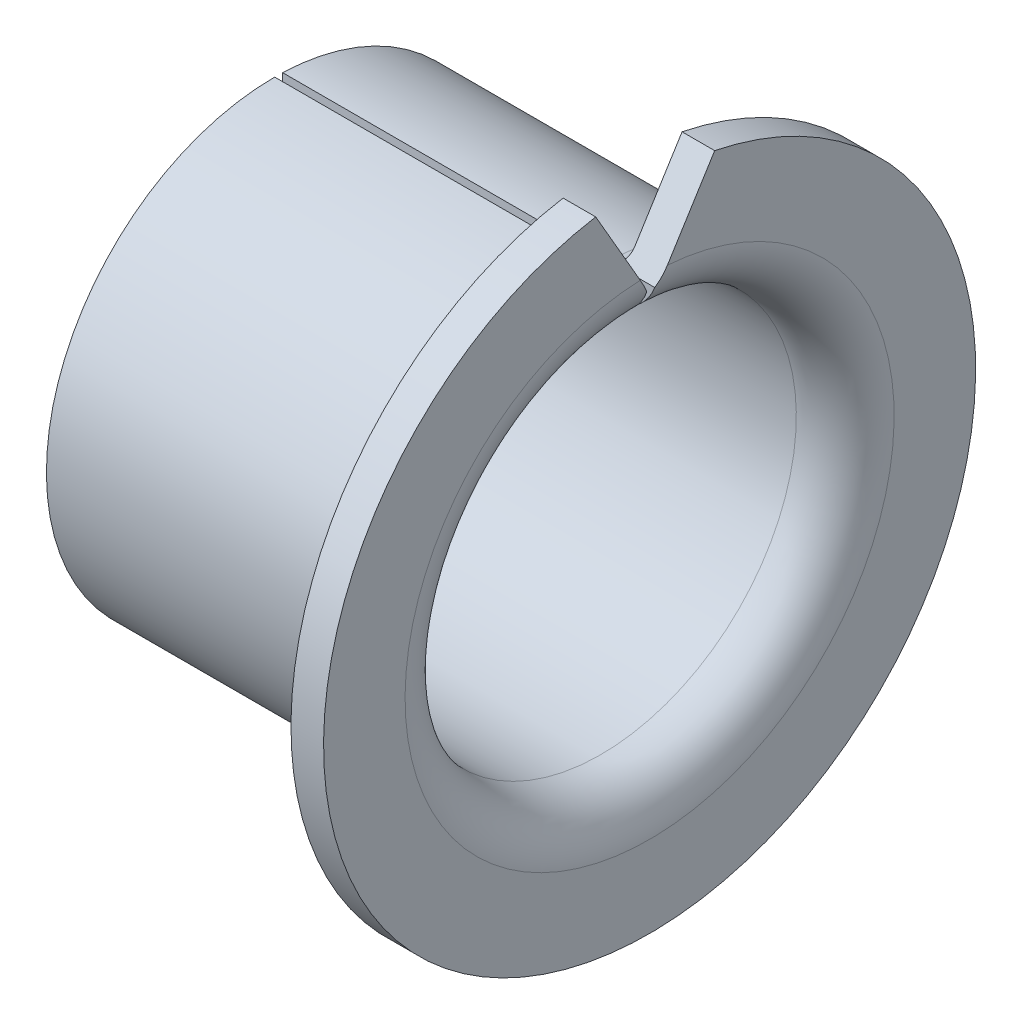
ISO-10303-21;
HEADER;
FILE_DESCRIPTION(('STEP AP214'),'2;1');
FILE_NAME('part.step','',(''),(''),'','','');
FILE_SCHEMA(('AUTOMOTIVE_DESIGN { 1 0 10303 214 1 1 1 1 }'));
ENDSEC;
DATA;
#1=APPLICATION_CONTEXT('core data for automotive mechanical design processes');
#2=APPLICATION_PROTOCOL_DEFINITION('international standard','automotive_design',2000,#1);
#3=PRODUCT_CONTEXT('',#1,'mechanical');
#4=PRODUCT('Part','Part','',(#3));
#5=PRODUCT_RELATED_PRODUCT_CATEGORY('part','',(#4));
#6=PRODUCT_DEFINITION_FORMATION('','',#4);
#7=PRODUCT_DEFINITION_CONTEXT('part definition',#1,'design');
#8=PRODUCT_DEFINITION('design','',#6,#7);
#9=PRODUCT_DEFINITION_SHAPE('','',#8);
#10=(LENGTH_UNIT() NAMED_UNIT(*) SI_UNIT(.MILLI.,.METRE.));
#11=(NAMED_UNIT(*) PLANE_ANGLE_UNIT() SI_UNIT($,.RADIAN.));
#12=(NAMED_UNIT(*) SI_UNIT($,.STERADIAN.) SOLID_ANGLE_UNIT());
#13=UNCERTAINTY_MEASURE_WITH_UNIT(LENGTH_MEASURE(1.E-05),#10,'distance_accuracy_value','');
#14=(GEOMETRIC_REPRESENTATION_CONTEXT(3) GLOBAL_UNCERTAINTY_ASSIGNED_CONTEXT((#13)) GLOBAL_UNIT_ASSIGNED_CONTEXT((#10,
#11,#12)) REPRESENTATION_CONTEXT('',''));
#15=CARTESIAN_POINT('',(0.,0.,0.));
#16=DIRECTION('',(0.,0.,1.));
#17=DIRECTION('',(1.,0.,0.));
#18=AXIS2_PLACEMENT_3D('',#15,#16,#17);
#19=CARTESIAN_POINT('',(10.,0.,0.));
#20=DIRECTION('',(-1.,0.,0.));
#21=DIRECTION('',(0.,0.,1.));
#22=AXIS2_PLACEMENT_3D('',#19,#20,#21);
#23=TOROIDAL_SURFACE('',#22,7.5,1.5);
#24=CARTESIAN_POINT('',(11.499988949231,7.5002,0.288790604648647));
#25=CARTESIAN_POINT('',(11.5001546386734,7.45775465983134,0.264284776076427));
#26=CARTESIAN_POINT('',(11.4984413437354,7.41531521186354,0.239782349367959));
#27=CARTESIAN_POINT('',(11.4913330317433,7.33090663893235,0.191049037064227));
#28=CARTESIAN_POINT('',(11.485958672951,7.28893621104406,0.166817399224915));
#29=CARTESIAN_POINT('',(11.4643997452174,7.16353320403578,0.0944159393715009));
#30=CARTESIAN_POINT('',(11.4427791658378,7.08077743629816,0.0466368745911877));
#31=CARTESIAN_POINT('',(11.4141428361213,6.99980000000054,-0.000115470053528239));
#32=B_SPLINE_CURVE_WITH_KNOTS('',3,(#24,#25,#26,#27,#28,#29,#30,#31),.UNSPECIFIED.,.F.,.F.,(4,2,
2,4),(0.,0.146975491171997,0.293128440273649,0.58601194646571),.UNSPECIFIED.);
#33=CARTESIAN_POINT('',(11.5,7.49456264653803,0.285535877109862));
#34=VERTEX_POINT('',#33);
#35=CARTESIAN_POINT('',(11.4142135623731,7.,0.));
#36=VERTEX_POINT('',#35);
#37=EDGE_CURVE('E47',#34,#36,#32,.T.);
#38=ORIENTED_EDGE('',*,*,#37,.F.);
#39=CARTESIAN_POINT('',(11.5,0.,0.));
#40=DIRECTION('',(-1.,0.,0.));
#41=DIRECTION('',(0.,0.,1.));
#42=AXIS2_PLACEMENT_3D('',#39,#40,#41);
#43=CIRCLE('',#42,7.5);
#44=CARTESIAN_POINT('',(11.5,7.48003210306843,-0.546918400737887));
#45=VERTEX_POINT('',#44);
#46=EDGE_CURVE('E120',#45,#34,#43,.T.);
#47=ORIENTED_EDGE('',*,*,#46,.F.);
#48=CARTESIAN_POINT('',(11.414141336497,6.99553578913414,-0.244171503047322));
#49=CARTESIAN_POINT('',(11.4436225034062,7.07717137729921,-0.295183080116763));
#50=CARTESIAN_POINT('',(11.4656674526405,7.16065124727563,-0.347347092366405));
#51=CARTESIAN_POINT('',(11.4872021827046,7.28714152839566,-0.426386992352702));
#52=CARTESIAN_POINT('',(11.4924588188797,7.32947172523746,-0.452837835019432));
#53=CARTESIAN_POINT('',(11.499108472332,7.41460324484908,-0.506033912506195));
#54=CARTESIAN_POINT('',(11.5004782376455,7.45740587156478,-0.532779962122051));
#55=CARTESIAN_POINT('',(11.499852412834,7.5002,-0.559520701422891));
#56=B_SPLINE_CURVE_WITH_KNOTS('',3,(#48,#49,#50,#51,#52,#53,#54,#55),.UNSPECIFIED.,.F.,.F.,(4,2,
2,4),(0.,0.301494829437284,0.451927606658095,0.60325842187371),.UNSPECIFIED.);
#57=CARTESIAN_POINT('',(11.4142135623731,6.99573578913367,-0.244296476917413));
#58=VERTEX_POINT('',#57);
#59=EDGE_CURVE('E150',#58,#45,#56,.T.);
#60=ORIENTED_EDGE('',*,*,#59,.F.);
#61=CARTESIAN_POINT('',(10.,7.49543120264322,-0.261746225268656));
#62=DIRECTION('',(0.,0.0348994967024875,0.999390827019096));
#63=DIRECTION('',(1.,0.,0.));
#64=AXIS2_PLACEMENT_3D('',#61,#62,#63);
#65=CIRCLE('',#64,1.5);
#66=CARTESIAN_POINT('',(10.,5.99634496211458,-0.209396980214925));
#67=VERTEX_POINT('',#66);
#68=EDGE_CURVE('E164',#67,#58,#65,.T.);
#69=ORIENTED_EDGE('',*,*,#68,.F.);
#70=CARTESIAN_POINT('',(10.,0.,0.));
#71=DIRECTION('',(-1.,0.,0.));
#72=DIRECTION('',(0.,0.,1.));
#73=AXIS2_PLACEMENT_3D('',#70,#71,#72);
#74=CIRCLE('',#73,6.);
#75=CARTESIAN_POINT('',(10.,6.,0.));
#76=VERTEX_POINT('',#75);
#77=EDGE_CURVE('E128',#67,#76,#74,.T.);
#78=ORIENTED_EDGE('',*,*,#77,.T.);
#79=CARTESIAN_POINT('',(10.,7.5,0.));
#80=DIRECTION('',(0.,0.,1.));
#81=DIRECTION('',(1.,0.,0.));
#82=AXIS2_PLACEMENT_3D('',#79,#80,#81);
#83=CIRCLE('',#82,1.5);
#84=EDGE_CURVE('E154',#76,#36,#83,.T.);
#85=ORIENTED_EDGE('',*,*,#84,.T.);
#86=EDGE_LOOP('',(#38,#47,#60,#69,#78,#85));
#87=FACE_BOUND('',#86,.T.);
#88=ADVANCED_FACE('F33',(#87),#23,.T.);
#89=CARTESIAN_POINT('',(11.5,9.99390827019096,-0.348994967024875));
#90=DIRECTION('',(-1.,0.,0.));
#91=DIRECTION('',(0.,0.,1.));
#92=AXIS2_PLACEMENT_3D('',#89,#90,#91);
#93=PLANE('',#92);
#94=DIRECTION('',(0.,-0.866025403784441,-0.499999999999995));
#95=VECTOR('',#94,1.);
#96=CARTESIAN_POINT('',(11.5,7.,0.));
#97=LINE('',#96,#95);
#98=CARTESIAN_POINT('',(11.5,9.86249036979398,1.65265958555324));
#99=VERTEX_POINT('',#98);
#100=EDGE_CURVE('E105',#99,#34,#97,.T.);
#101=ORIENTED_EDGE('',*,*,#100,.F.);
#102=CARTESIAN_POINT('',(11.5,0.,0.));
#103=DIRECTION('',(-1.,0.,0.));
#104=DIRECTION('',(0.,0.,1.));
#105=AXIS2_PLACEMENT_3D('',#102,#103,#104);
#106=CIRCLE('',#105,10.);
#107=CARTESIAN_POINT('',(11.5,9.79880541937993,-1.99584878012603));
#108=VERTEX_POINT('',#107);
#109=EDGE_CURVE('E118',#108,#99,#106,.T.);
#110=ORIENTED_EDGE('',*,*,#109,.F.);
#111=DIRECTION('',(0.,0.848048096156437,-0.529919264233188));
#112=VECTOR('',#111,1.);
#113=CARTESIAN_POINT('',(11.5,6.99573578913367,-0.244296476917413));
#114=LINE('',#113,#112);
#115=EDGE_CURVE('E121',#45,#108,#114,.T.);
#116=ORIENTED_EDGE('',*,*,#115,.F.);
#117=ORIENTED_EDGE('',*,*,#46,.T.);
#118=EDGE_LOOP('',(#101,#110,#116,#117));
#119=FACE_BOUND('',#118,.T.);
#120=ADVANCED_FACE('F116',(#119),#93,.F.);
#121=CARTESIAN_POINT('',(0.,0.,0.));
#122=DIRECTION('',(-1.,0.,0.));
#123=DIRECTION('',(0.,0.,1.));
#124=AXIS2_PLACEMENT_3D('',#121,#122,#123);
#125=CYLINDRICAL_SURFACE('',#124,10.);
#126=DIRECTION('',(-1.,0.,0.));
#127=VECTOR('',#126,1.);
#128=CARTESIAN_POINT('',(0.,9.86249036979398,1.65265958555324));
#129=LINE('',#128,#127);
#130=CARTESIAN_POINT('',(10.5,9.86249036979398,1.65265958555324));
#131=VERTEX_POINT('',#130);
#132=EDGE_CURVE('E102',#131,#99,#129,.F.);
#133=ORIENTED_EDGE('',*,*,#132,.F.);
#134=CARTESIAN_POINT('',(10.5,0.,0.));
#135=DIRECTION('',(-1.,0.,0.));
#136=DIRECTION('',(0.,0.,1.));
#137=AXIS2_PLACEMENT_3D('',#134,#135,#136);
#138=CIRCLE('',#137,10.);
#139=CARTESIAN_POINT('',(10.5,9.79880541937993,-1.99584878012603));
#140=VERTEX_POINT('',#139);
#141=EDGE_CURVE('E126',#140,#131,#138,.T.);
#142=ORIENTED_EDGE('',*,*,#141,.F.);
#143=DIRECTION('',(-1.,0.,0.));
#144=VECTOR('',#143,1.);
#145=CARTESIAN_POINT('',(0.,9.79880541937993,-1.99584878012603));
#146=LINE('',#145,#144);
#147=EDGE_CURVE('E125',#108,#140,#146,.T.);
#148=ORIENTED_EDGE('',*,*,#147,.F.);
#149=ORIENTED_EDGE('',*,*,#109,.T.);
#150=EDGE_LOOP('',(#133,#142,#148,#149));
#151=FACE_BOUND('',#150,.T.);
#152=ADVANCED_FACE('F124',(#151),#125,.T.);
#153=CARTESIAN_POINT('',(10.5,7.49543120264322,-0.261746225268656));
#154=DIRECTION('',(1.,0.,0.));
#155=DIRECTION('',(0.,0.,-1.));
#156=AXIS2_PLACEMENT_3D('',#153,#154,#155);
#157=PLANE('',#156);
#158=DIRECTION('',(0.,0.866025403784442,0.499999999999995));
#159=VECTOR('',#158,1.);
#160=CARTESIAN_POINT('',(10.5,7.25823396176875,0.149091447341089));
#161=LINE('',#160,#159);
#162=CARTESIAN_POINT('',(10.5,7.49456264653803,0.285535877109862));
#163=VERTEX_POINT('',#162);
#164=EDGE_CURVE('E107',#163,#131,#161,.T.);
#165=ORIENTED_EDGE('',*,*,#164,.F.);
#166=CARTESIAN_POINT('',(10.5,0.,0.));
#167=DIRECTION('',(-1.,0.,0.));
#168=DIRECTION('',(0.,0.,1.));
#169=AXIS2_PLACEMENT_3D('',#166,#167,#168);
#170=CIRCLE('',#169,7.5);
#171=CARTESIAN_POINT('',(10.5,7.48003210306843,-0.546918400737887));
#172=VERTEX_POINT('',#171);
#173=EDGE_CURVE('E130',#172,#163,#170,.T.);
#174=ORIENTED_EDGE('',*,*,#173,.F.);
#175=DIRECTION('',(0.,-0.848048096156437,0.529919264233188));
#176=VECTOR('',#175,1.);
#177=CARTESIAN_POINT('',(10.5,7.36295138658493,-0.473758249307763));
#178=LINE('',#177,#176);
#179=EDGE_CURVE('E185',#140,#172,#178,.T.);
#180=ORIENTED_EDGE('',*,*,#179,.F.);
#181=ORIENTED_EDGE('',*,*,#141,.T.);
#182=EDGE_LOOP('',(#165,#174,#180,#181));
#183=FACE_BOUND('',#182,.T.);
#184=ADVANCED_FACE('F184',(#183),#157,.F.);
#185=CARTESIAN_POINT('',(10.,0.,0.));
#186=DIRECTION('',(-1.,0.,0.));
#187=DIRECTION('',(0.,0.,1.));
#188=AXIS2_PLACEMENT_3D('',#185,#186,#187);
#189=TOROIDAL_SURFACE('',#188,7.5,0.5);
#190=CARTESIAN_POINT('',(9.9998,7.00000004,2.30940116582646E-08));
#191=CARTESIAN_POINT('',(10.0253037740322,6.9999557658286,-2.55386107650364E-05));
#192=CARTESIAN_POINT('',(10.0507781945536,7.00192858001131,0.00111346618868244));
#193=CARTESIAN_POINT('',(10.1008452282943,7.00963144951031,0.00556071996746512));
#194=CARTESIAN_POINT('',(10.1254412777348,7.01534465008048,0.00885923785458396));
#195=CARTESIAN_POINT('',(10.1731468026979,7.0302486041362,0.0174640397406469));
#196=CARTESIAN_POINT('',(10.1962576647902,7.03943605721566,0.0227684182492362));
#197=CARTESIAN_POINT('',(10.2405131681029,7.06087220322616,0.0351445829187907));
#198=CARTESIAN_POINT('',(10.261656011807,7.07312365777798,0.0422179635022477));
#199=CARTESIAN_POINT('',(10.3026632944049,7.10096232669499,0.0582906264953648));
#200=CARTESIAN_POINT('',(10.3223959445293,7.11669456743437,0.0673736399211999));
#201=CARTESIAN_POINT('',(10.3589487223443,7.15050866969775,0.0868962209653701));
#202=CARTESIAN_POINT('',(10.3757681579009,7.16859108780571,0.0973361099275982));
#203=CARTESIAN_POINT('',(10.4082661647061,7.20903080620435,0.120683992231007));
#204=CARTESIAN_POINT('',(10.4235278691507,7.23163932401179,0.133737026073107));
#205=CARTESIAN_POINT('',(10.4499935055352,7.27858501187144,0.160841131596168));
#206=CARTESIAN_POINT('',(10.4611934256745,7.30292386274671,0.174893173700774));
#207=CARTESIAN_POINT('',(10.480498225822,7.35565411169121,0.205336997123314));
#208=CARTESIAN_POINT('',(10.4880892677134,7.38418694066587,0.221810433612575));
#209=CARTESIAN_POINT('',(10.4979940216153,7.44189175680274,0.255126324742735));
#210=CARTESIAN_POINT('',(10.5003150783787,7.47106279713503,0.271968232731124));
#211=CARTESIAN_POINT('',(10.4999668467159,7.5002,0.288790604648647));
#212=B_SPLINE_CURVE_WITH_KNOTS('',3,(#190,#191,#192,#193,#194,#195,#196,#197,#198,#199,#200,
#201,#202,#203,#204,#205,#206,#207,#208,#209,#210,#211),.UNSPECIFIED.,.F.,.F.,(4,2,2,2,2,2,2,2,
2,2,4),(0.,0.0763609580493929,0.152380168744674,0.228327344794787,0.304343221196065,
0.384487438569429,0.464650670909387,0.555004942316034,0.645448214608619,0.746448061548382,
0.847307058857616),.UNSPECIFIED.);
#213=CARTESIAN_POINT('',(10.,7.,0.));
#214=VERTEX_POINT('',#213);
#215=EDGE_CURVE('E180',#214,#163,#212,.T.);
#216=ORIENTED_EDGE('',*,*,#215,.F.);
#217=CARTESIAN_POINT('',(10.,0.,0.));
#218=DIRECTION('',(-1.,0.,0.));
#219=DIRECTION('',(0.,0.,1.));
#220=AXIS2_PLACEMENT_3D('',#217,#218,#219);
#221=CIRCLE('',#220,7.);
#222=CARTESIAN_POINT('',(10.,6.99573578913367,-0.244296476917413));
#223=VERTEX_POINT('',#222);
#224=EDGE_CURVE('E171',#223,#214,#221,.T.);
#225=ORIENTED_EDGE('',*,*,#224,.F.);
#226=CARTESIAN_POINT('',(10.4995570640917,7.5002,-0.55952070142289));
#227=CARTESIAN_POINT('',(10.5008895986768,7.46999372512151,-0.540645726015975));
#228=CARTESIAN_POINT('',(10.4992247675039,7.43968930036426,-0.521709419757926));
#229=CARTESIAN_POINT('',(10.4899775828871,7.37965443980439,-0.484195475347919));
#230=CARTESIAN_POINT('',(10.482379263995,7.34992577472551,-0.465618943666949));
#231=CARTESIAN_POINT('',(10.4613242304461,7.29195252591046,-0.429393237251809));
#232=CARTESIAN_POINT('',(10.4478609471734,7.26370964608221,-0.411745127237483));
#233=CARTESIAN_POINT('',(10.4152284875559,7.20970885517926,-0.378001688023367));
#234=CARTESIAN_POINT('',(10.3960642119462,7.18394883484791,-0.361905040813746));
#235=CARTESIAN_POINT('',(10.3535175246337,7.13729934882034,-0.332755206712795));
#236=CARTESIAN_POINT('',(10.3304275813392,7.1162191270107,-0.319582822172502));
#237=CARTESIAN_POINT('',(10.2798413099806,7.07825073323885,-0.295857536563246));
#238=CARTESIAN_POINT('',(10.2523481799817,7.06135954127584,-0.285302748388344));
#239=CARTESIAN_POINT('',(10.1976151881656,7.03470319018928,-0.268646011560622));
#240=CARTESIAN_POINT('',(10.1708096263736,7.02429608434643,-0.262142930077347));
#241=CARTESIAN_POINT('',(10.1153511316611,7.0081054702671,-0.25202591155058));
#242=CARTESIAN_POINT('',(10.0867034029127,7.0023095063722,-0.248404191347884));
#243=CARTESIAN_POINT('',(10.0481078957686,6.99791429655673,-0.24565775943899));
#244=CARTESIAN_POINT('',(10.0384654531744,6.99709432343856,-0.245145383368053));
#245=CARTESIAN_POINT('',(10.01915045119,6.99600391465375,-0.244464020337371));
#246=CARTESIAN_POINT('',(10.0094779495952,6.99573274285883,-0.244294573393627));
#247=CARTESIAN_POINT('',(9.9998,6.99573582830334,-0.244296501393336));
#248=B_SPLINE_CURVE_WITH_KNOTS('',3,(#226,#227,#228,#229,#230,#231,#232,#233,#234,#235,#236,
#237,#238,#239,#240,#241,#242,#243,#244,#245,#246,#247),.UNSPECIFIED.,.F.,.F.,(4,2,2,2,2,2,2,2,
2,2,4),(0.,0.106815835550836,0.213920078823562,0.321144585858795,0.428277184708491,
0.529475221429587,0.630600087884889,0.71854077763549,0.806243106916561,0.835299411351108,
0.864316715549116),.UNSPECIFIED.);
#249=EDGE_CURVE('E181',#172,#223,#248,.T.);
#250=ORIENTED_EDGE('',*,*,#249,.F.);
#251=ORIENTED_EDGE('',*,*,#173,.T.);
#252=EDGE_LOOP('',(#216,#225,#250,#251));
#253=FACE_BOUND('',#252,.T.);
#254=ADVANCED_FACE('F178',(#253),#189,.F.);
#255=CARTESIAN_POINT('',(10.,7.49543120264322,-0.261746225268656));
#256=DIRECTION('',(0.,0.0348994967024875,0.999390827019096));
#257=DIRECTION('',(1.,0.,0.));
#258=AXIS2_PLACEMENT_3D('',#255,#256,#257);
#259=PLANE('',#258);
#260=ORIENTED_EDGE('',*,*,#68,.T.);
#261=DIRECTION('',(-1.,0.,0.));
#262=VECTOR('',#261,1.);
#263=CARTESIAN_POINT('',(11.5,6.99573578913367,-0.244296476917413));
#264=LINE('',#263,#262);
#265=EDGE_CURVE('E187',#58,#223,#264,.T.);
#266=ORIENTED_EDGE('',*,*,#265,.T.);
#267=DIRECTION('',(-1.,0.,0.));
#268=VECTOR('',#267,1.);
#269=CARTESIAN_POINT('',(0.,6.99573578913367,-0.244296476917413));
#270=LINE('',#269,#268);
#271=CARTESIAN_POINT('',(0.,6.99573578913367,-0.244296476917413));
#272=VERTEX_POINT('',#271);
#273=EDGE_CURVE('E167',#223,#272,#270,.T.);
#274=ORIENTED_EDGE('',*,*,#273,.T.);
#275=DIRECTION('',(0.,-0.999390827019096,0.0348994967024875));
#276=VECTOR('',#275,1.);
#277=CARTESIAN_POINT('',(0.,6.99573578913367,-0.244296476917413));
#278=LINE('',#277,#276);
#279=CARTESIAN_POINT('',(0.,5.99634496211458,-0.209396980214925));
#280=VERTEX_POINT('',#279);
#281=EDGE_CURVE('E161',#272,#280,#278,.T.);
#282=ORIENTED_EDGE('',*,*,#281,.T.);
#283=DIRECTION('',(1.,0.,0.));
#284=VECTOR('',#283,1.);
#285=CARTESIAN_POINT('',(0.,5.99634496211458,-0.209396980214925));
#286=LINE('',#285,#284);
#287=EDGE_CURVE('E142',#280,#67,#286,.T.);
#288=ORIENTED_EDGE('',*,*,#287,.T.);
#289=EDGE_LOOP('',(#260,#266,#274,#282,#288));
#290=FACE_BOUND('',#289,.T.);
#291=ADVANCED_FACE('F216',(#290),#259,.T.);
#292=CARTESIAN_POINT('',(10.,7.5,0.));
#293=DIRECTION('',(0.,0.,1.));
#294=DIRECTION('',(1.,0.,0.));
#295=AXIS2_PLACEMENT_3D('',#292,#293,#294);
#296=PLANE('',#295);
#297=DIRECTION('',(-1.,0.,0.));
#298=VECTOR('',#297,1.);
#299=CARTESIAN_POINT('',(10.,7.,0.));
#300=LINE('',#299,#298);
#301=EDGE_CURVE('E11',#36,#214,#300,.T.);
#302=ORIENTED_EDGE('',*,*,#301,.F.);
#303=ORIENTED_EDGE('',*,*,#84,.F.);
#304=DIRECTION('',(1.,0.,0.));
#305=VECTOR('',#304,1.);
#306=CARTESIAN_POINT('',(0.,6.,0.));
#307=LINE('',#306,#305);
#308=CARTESIAN_POINT('',(0.,6.,0.));
#309=VERTEX_POINT('',#308);
#310=EDGE_CURVE('E139',#309,#76,#307,.T.);
#311=ORIENTED_EDGE('',*,*,#310,.F.);
#312=DIRECTION('',(0.,-1.,0.));
#313=VECTOR('',#312,1.);
#314=CARTESIAN_POINT('',(0.,7.,0.));
#315=LINE('',#314,#313);
#316=CARTESIAN_POINT('',(0.,7.,0.));
#317=VERTEX_POINT('',#316);
#318=EDGE_CURVE('E146',#317,#309,#315,.T.);
#319=ORIENTED_EDGE('',*,*,#318,.F.);
#320=DIRECTION('',(-1.,0.,0.));
#321=VECTOR('',#320,1.);
#322=CARTESIAN_POINT('',(0.,7.,0.));
#323=LINE('',#322,#321);
#324=EDGE_CURVE('E156',#214,#317,#323,.T.);
#325=ORIENTED_EDGE('',*,*,#324,.F.);
#326=EDGE_LOOP('',(#302,#303,#311,#319,#325));
#327=FACE_BOUND('',#326,.T.);
#328=ADVANCED_FACE('F152',(#327),#296,.F.);
#329=CARTESIAN_POINT('',(0.,6.99573578913367,-0.244296476917413));
#330=DIRECTION('',(1.,0.,0.));
#331=DIRECTION('',(0.,0.,-1.));
#332=AXIS2_PLACEMENT_3D('',#329,#330,#331);
#333=PLANE('',#332);
#334=CARTESIAN_POINT('',(0.,0.,0.));
#335=DIRECTION('',(-1.,0.,0.));
#336=DIRECTION('',(0.,0.,1.));
#337=AXIS2_PLACEMENT_3D('',#334,#335,#336);
#338=CIRCLE('',#337,6.);
#339=EDGE_CURVE('E41',#280,#309,#338,.T.);
#340=ORIENTED_EDGE('',*,*,#339,.F.);
#341=ORIENTED_EDGE('',*,*,#281,.F.);
#342=CARTESIAN_POINT('',(0.,0.,0.));
#343=DIRECTION('',(-1.,0.,0.));
#344=DIRECTION('',(0.,0.,1.));
#345=AXIS2_PLACEMENT_3D('',#342,#343,#344);
#346=CIRCLE('',#345,7.);
#347=EDGE_CURVE('E55',#272,#317,#346,.T.);
#348=ORIENTED_EDGE('',*,*,#347,.T.);
#349=ORIENTED_EDGE('',*,*,#318,.T.);
#350=EDGE_LOOP('',(#340,#341,#348,#349));
#351=FACE_BOUND('',#350,.T.);
#352=ADVANCED_FACE('F147',(#351),#333,.F.);
#353=CARTESIAN_POINT('',(0.,0.,0.));
#354=DIRECTION('',(-1.,0.,0.));
#355=DIRECTION('',(0.,0.,1.));
#356=AXIS2_PLACEMENT_3D('',#353,#354,#355);
#357=CYLINDRICAL_SURFACE('',#356,6.);
#358=ORIENTED_EDGE('',*,*,#77,.F.);
#359=ORIENTED_EDGE('',*,*,#287,.F.);
#360=ORIENTED_EDGE('',*,*,#339,.T.);
#361=ORIENTED_EDGE('',*,*,#310,.T.);
#362=EDGE_LOOP('',(#358,#359,#360,#361));
#363=FACE_BOUND('',#362,.T.);
#364=ADVANCED_FACE('F35',(#363),#357,.F.);
#365=CARTESIAN_POINT('',(0.,0.,0.));
#366=DIRECTION('',(-1.,0.,0.));
#367=DIRECTION('',(0.,0.,1.));
#368=AXIS2_PLACEMENT_3D('',#365,#366,#367);
#369=CYLINDRICAL_SURFACE('',#368,7.);
#370=ORIENTED_EDGE('',*,*,#273,.F.);
#371=ORIENTED_EDGE('',*,*,#224,.T.);
#372=ORIENTED_EDGE('',*,*,#324,.T.);
#373=ORIENTED_EDGE('',*,*,#347,.F.);
#374=EDGE_LOOP('',(#370,#371,#372,#373));
#375=FACE_BOUND('',#374,.T.);
#376=ADVANCED_FACE('F211',(#375),#369,.T.);
#377=CARTESIAN_POINT('',(11.5,7.,0.));
#378=DIRECTION('',(0.,0.499999999999995,-0.866025403784441));
#379=DIRECTION('',(0.,0.866025403784442,0.499999999999995));
#380=AXIS2_PLACEMENT_3D('',#377,#378,#379);
#381=PLANE('',#380);
#382=ORIENTED_EDGE('',*,*,#37,.T.);
#383=ORIENTED_EDGE('',*,*,#301,.T.);
#384=ORIENTED_EDGE('',*,*,#215,.T.);
#385=ORIENTED_EDGE('',*,*,#164,.T.);
#386=ORIENTED_EDGE('',*,*,#132,.T.);
#387=ORIENTED_EDGE('',*,*,#100,.T.);
#388=EDGE_LOOP('',(#382,#383,#384,#385,#386,#387));
#389=FACE_BOUND('',#388,.T.);
#390=ADVANCED_FACE('F104',(#389),#381,.T.);
#391=CARTESIAN_POINT('',(11.5,6.99573578913367,-0.244296476917413));
#392=DIRECTION('',(0.,0.529919264233188,0.848048096156437));
#393=DIRECTION('',(0.,-0.848048096156437,0.529919264233188));
#394=AXIS2_PLACEMENT_3D('',#391,#392,#393);
#395=PLANE('',#394);
#396=ORIENTED_EDGE('',*,*,#59,.T.);
#397=ORIENTED_EDGE('',*,*,#115,.T.);
#398=ORIENTED_EDGE('',*,*,#147,.T.);
#399=ORIENTED_EDGE('',*,*,#179,.T.);
#400=ORIENTED_EDGE('',*,*,#249,.T.);
#401=ORIENTED_EDGE('',*,*,#265,.F.);
#402=EDGE_LOOP('',(#396,#397,#398,#399,#400,#401));
#403=FACE_BOUND('',#402,.T.);
#404=ADVANCED_FACE('F210',(#403),#395,.T.);
#405=CLOSED_SHELL('',(#88,#120,#152,#184,#254,#291,#328,#352,#364,#376,#390,#404));
#406=MANIFOLD_SOLID_BREP('B2',#405);
#407=ADVANCED_BREP_SHAPE_REPRESENTATION('',(#18,#406),#14);
#408=SHAPE_DEFINITION_REPRESENTATION(#9,#407);
ENDSEC;
END-ISO-10303-21;
